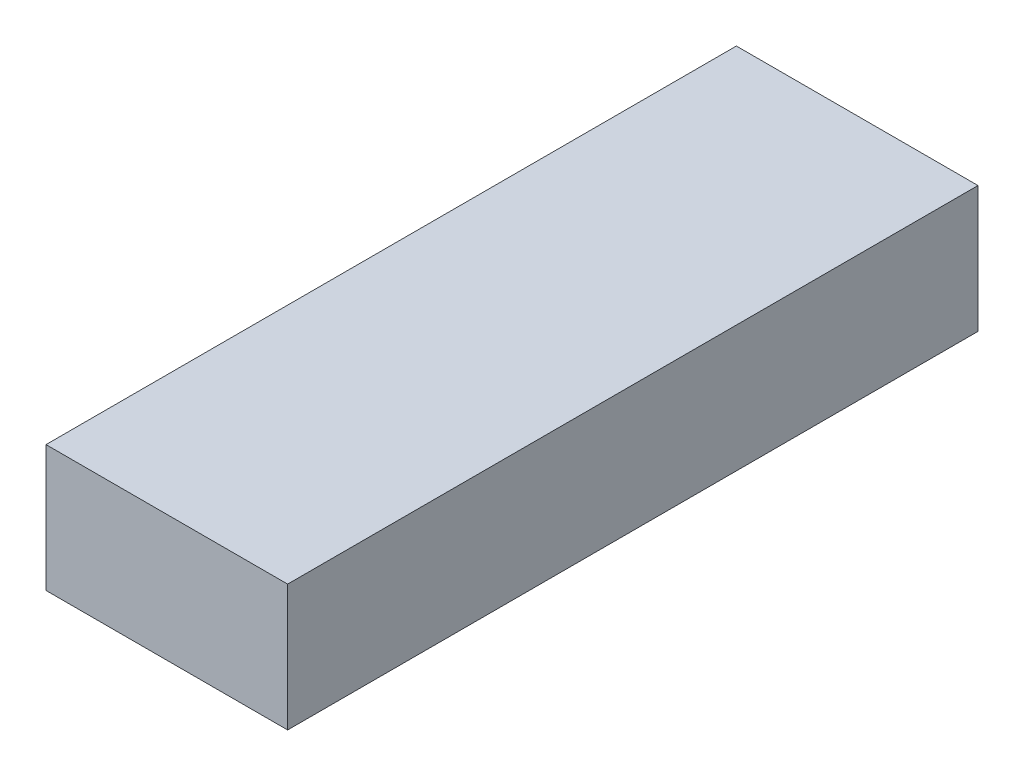
ISO-10303-21;
HEADER;
FILE_DESCRIPTION(('STEP AP214'),'2;1');
FILE_NAME('part.step','',(''),(''),'','','');
FILE_SCHEMA(('AUTOMOTIVE_DESIGN { 1 0 10303 214 1 1 1 1 }'));
ENDSEC;
DATA;
#1=APPLICATION_CONTEXT('core data for automotive mechanical design processes');
#2=APPLICATION_PROTOCOL_DEFINITION('international standard','automotive_design',2000,#1);
#3=PRODUCT_CONTEXT('',#1,'mechanical');
#4=PRODUCT('Part','Part','',(#3));
#5=PRODUCT_RELATED_PRODUCT_CATEGORY('part','',(#4));
#6=PRODUCT_DEFINITION_FORMATION('','',#4);
#7=PRODUCT_DEFINITION_CONTEXT('part definition',#1,'design');
#8=PRODUCT_DEFINITION('design','',#6,#7);
#9=PRODUCT_DEFINITION_SHAPE('','',#8);
#10=(LENGTH_UNIT() NAMED_UNIT(*) SI_UNIT(.MILLI.,.METRE.));
#11=(NAMED_UNIT(*) PLANE_ANGLE_UNIT() SI_UNIT($,.RADIAN.));
#12=(NAMED_UNIT(*) SI_UNIT($,.STERADIAN.) SOLID_ANGLE_UNIT());
#13=UNCERTAINTY_MEASURE_WITH_UNIT(LENGTH_MEASURE(1.E-05),#10,'distance_accuracy_value','');
#14=(GEOMETRIC_REPRESENTATION_CONTEXT(3) GLOBAL_UNCERTAINTY_ASSIGNED_CONTEXT((#13)) GLOBAL_UNIT_ASSIGNED_CONTEXT((#10,
#11,#12)) REPRESENTATION_CONTEXT('',''));
#15=CARTESIAN_POINT('',(0.,0.,0.));
#16=DIRECTION('',(0.,0.,1.));
#17=DIRECTION('',(1.,0.,0.));
#18=AXIS2_PLACEMENT_3D('',#15,#16,#17);
#19=CARTESIAN_POINT('',(0.,0.,25.4));
#20=DIRECTION('',(1.,0.,0.));
#21=DIRECTION('',(0.,0.,-1.));
#22=AXIS2_PLACEMENT_3D('',#19,#20,#21);
#23=PLANE('',#22);
#24=DIRECTION('',(0.,-1.,0.));
#25=VECTOR('',#24,1.);
#26=CARTESIAN_POINT('',(0.,0.,0.));
#27=LINE('',#26,#25);
#28=CARTESIAN_POINT('',(0.,4.6482,0.));
#29=VERTEX_POINT('',#28);
#30=CARTESIAN_POINT('',(0.,0.,0.));
#31=VERTEX_POINT('',#30);
#32=EDGE_CURVE('E98',#29,#31,#27,.T.);
#33=ORIENTED_EDGE('',*,*,#32,.T.);
#34=DIRECTION('',(0.,0.,-1.));
#35=VECTOR('',#34,1.);
#36=CARTESIAN_POINT('',(0.,0.,25.4));
#37=LINE('',#36,#35);
#38=CARTESIAN_POINT('',(0.,0.,25.4));
#39=VERTEX_POINT('',#38);
#40=EDGE_CURVE('E11',#39,#31,#37,.T.);
#41=ORIENTED_EDGE('',*,*,#40,.F.);
#42=DIRECTION('',(0.,-1.,0.));
#43=VECTOR('',#42,1.);
#44=CARTESIAN_POINT('',(0.,0.,25.4));
#45=LINE('',#44,#43);
#46=CARTESIAN_POINT('',(0.,4.6482,25.4));
#47=VERTEX_POINT('',#46);
#48=EDGE_CURVE('E86',#47,#39,#45,.T.);
#49=ORIENTED_EDGE('',*,*,#48,.F.);
#50=DIRECTION('',(0.,0.,-1.));
#51=VECTOR('',#50,1.);
#52=CARTESIAN_POINT('',(0.,4.6482,25.4));
#53=LINE('',#52,#51);
#54=EDGE_CURVE('E94',#47,#29,#53,.T.);
#55=ORIENTED_EDGE('',*,*,#54,.T.);
#56=EDGE_LOOP('',(#33,#41,#49,#55));
#57=FACE_BOUND('',#56,.T.);
#58=ADVANCED_FACE('F35',(#57),#23,.F.);
#59=CARTESIAN_POINT('',(0.,0.,25.4));
#60=DIRECTION('',(0.,1.,0.));
#61=DIRECTION('',(0.,0.,1.));
#62=AXIS2_PLACEMENT_3D('',#59,#60,#61);
#63=PLANE('',#62);
#64=DIRECTION('',(1.,0.,0.));
#65=VECTOR('',#64,1.);
#66=CARTESIAN_POINT('',(0.,0.,0.));
#67=LINE('',#66,#65);
#68=CARTESIAN_POINT('',(8.89,0.,0.));
#69=VERTEX_POINT('',#68);
#70=EDGE_CURVE('E90',#31,#69,#67,.T.);
#71=ORIENTED_EDGE('',*,*,#70,.T.);
#72=DIRECTION('',(0.,0.,-1.));
#73=VECTOR('',#72,1.);
#74=CARTESIAN_POINT('',(8.89,0.,25.4));
#75=LINE('',#74,#73);
#76=CARTESIAN_POINT('',(8.89,0.,25.4));
#77=VERTEX_POINT('',#76);
#78=EDGE_CURVE('E43',#77,#69,#75,.T.);
#79=ORIENTED_EDGE('',*,*,#78,.F.);
#80=DIRECTION('',(1.,0.,0.));
#81=VECTOR('',#80,1.);
#82=CARTESIAN_POINT('',(0.,0.,25.4));
#83=LINE('',#82,#81);
#84=EDGE_CURVE('E81',#39,#77,#83,.T.);
#85=ORIENTED_EDGE('',*,*,#84,.F.);
#86=ORIENTED_EDGE('',*,*,#40,.T.);
#87=EDGE_LOOP('',(#71,#79,#85,#86));
#88=FACE_BOUND('',#87,.T.);
#89=ADVANCED_FACE('F89',(#88),#63,.F.);
#90=CARTESIAN_POINT('',(8.89,0.,25.4));
#91=DIRECTION('',(-1.,0.,0.));
#92=DIRECTION('',(0.,0.,1.));
#93=AXIS2_PLACEMENT_3D('',#90,#91,#92);
#94=PLANE('',#93);
#95=DIRECTION('',(0.,1.,0.));
#96=VECTOR('',#95,1.);
#97=CARTESIAN_POINT('',(8.89,0.,0.));
#98=LINE('',#97,#96);
#99=CARTESIAN_POINT('',(8.89,4.6482,0.));
#100=VERTEX_POINT('',#99);
#101=EDGE_CURVE('E68',#69,#100,#98,.T.);
#102=ORIENTED_EDGE('',*,*,#101,.T.);
#103=DIRECTION('',(0.,0.,-1.));
#104=VECTOR('',#103,1.);
#105=CARTESIAN_POINT('',(8.89,4.6482,25.4));
#106=LINE('',#105,#104);
#107=CARTESIAN_POINT('',(8.89,4.6482,25.4));
#108=VERTEX_POINT('',#107);
#109=EDGE_CURVE('E91',#108,#100,#106,.T.);
#110=ORIENTED_EDGE('',*,*,#109,.F.);
#111=DIRECTION('',(0.,1.,0.));
#112=VECTOR('',#111,1.);
#113=CARTESIAN_POINT('',(8.89,0.,25.4));
#114=LINE('',#113,#112);
#115=EDGE_CURVE('E84',#77,#108,#114,.T.);
#116=ORIENTED_EDGE('',*,*,#115,.F.);
#117=ORIENTED_EDGE('',*,*,#78,.T.);
#118=EDGE_LOOP('',(#102,#110,#116,#117));
#119=FACE_BOUND('',#118,.T.);
#120=ADVANCED_FACE('F92',(#119),#94,.F.);
#121=CARTESIAN_POINT('',(0.,4.6482,25.4));
#122=DIRECTION('',(0.,-1.,0.));
#123=DIRECTION('',(0.,0.,-1.));
#124=AXIS2_PLACEMENT_3D('',#121,#122,#123);
#125=PLANE('',#124);
#126=DIRECTION('',(-1.,0.,0.));
#127=VECTOR('',#126,1.);
#128=CARTESIAN_POINT('',(0.,4.6482,0.));
#129=LINE('',#128,#127);
#130=EDGE_CURVE('E74',#100,#29,#129,.T.);
#131=ORIENTED_EDGE('',*,*,#130,.T.);
#132=ORIENTED_EDGE('',*,*,#54,.F.);
#133=DIRECTION('',(-1.,0.,0.));
#134=VECTOR('',#133,1.);
#135=CARTESIAN_POINT('',(0.,4.6482,25.4));
#136=LINE('',#135,#134);
#137=EDGE_CURVE('E51',#108,#47,#136,.T.);
#138=ORIENTED_EDGE('',*,*,#137,.F.);
#139=ORIENTED_EDGE('',*,*,#109,.T.);
#140=EDGE_LOOP('',(#131,#132,#138,#139));
#141=FACE_BOUND('',#140,.T.);
#142=ADVANCED_FACE('F105',(#141),#125,.F.);
#143=CARTESIAN_POINT('',(0.,0.,25.4));
#144=DIRECTION('',(0.,0.,-1.));
#145=DIRECTION('',(-1.,0.,0.));
#146=AXIS2_PLACEMENT_3D('',#143,#144,#145);
#147=PLANE('',#146);
#148=ORIENTED_EDGE('',*,*,#48,.T.);
#149=ORIENTED_EDGE('',*,*,#84,.T.);
#150=ORIENTED_EDGE('',*,*,#115,.T.);
#151=ORIENTED_EDGE('',*,*,#137,.T.);
#152=EDGE_LOOP('',(#148,#149,#150,#151));
#153=FACE_BOUND('',#152,.T.);
#154=ADVANCED_FACE('F82',(#153),#147,.F.);
#155=CARTESIAN_POINT('',(0.,0.,0.));
#156=DIRECTION('',(0.,0.,-1.));
#157=DIRECTION('',(-1.,0.,0.));
#158=AXIS2_PLACEMENT_3D('',#155,#156,#157);
#159=PLANE('',#158);
#160=ORIENTED_EDGE('',*,*,#32,.F.);
#161=ORIENTED_EDGE('',*,*,#130,.F.);
#162=ORIENTED_EDGE('',*,*,#101,.F.);
#163=ORIENTED_EDGE('',*,*,#70,.F.);
#164=EDGE_LOOP('',(#160,#161,#162,#163));
#165=FACE_BOUND('',#164,.T.);
#166=ADVANCED_FACE('F108',(#165),#159,.T.);
#167=CLOSED_SHELL('',(#58,#89,#120,#142,#154,#166));
#168=MANIFOLD_SOLID_BREP('B2',#167);
#169=ADVANCED_BREP_SHAPE_REPRESENTATION('',(#18,#168),#14);
#170=SHAPE_DEFINITION_REPRESENTATION(#9,#169);
ENDSEC;
END-ISO-10303-21;
